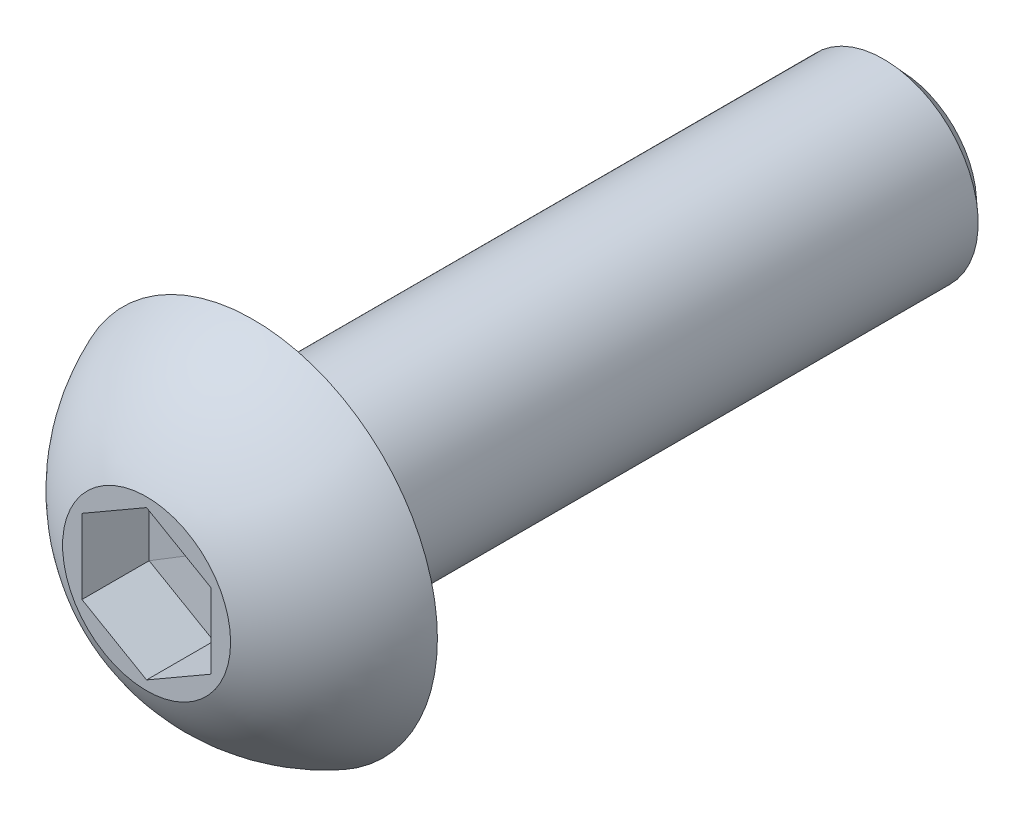
ISO-10303-21;
HEADER;
FILE_DESCRIPTION(('STEP AP214'),'2;1');
FILE_NAME('part.step','',(''),(''),'','','');
FILE_SCHEMA(('AUTOMOTIVE_DESIGN { 1 0 10303 214 1 1 1 1 }'));
ENDSEC;
DATA;
#1=APPLICATION_CONTEXT('core data for automotive mechanical design processes');
#2=APPLICATION_PROTOCOL_DEFINITION('international standard','automotive_design',2000,#1);
#3=PRODUCT_CONTEXT('',#1,'mechanical');
#4=PRODUCT('Part','Part','',(#3));
#5=PRODUCT_RELATED_PRODUCT_CATEGORY('part','',(#4));
#6=PRODUCT_DEFINITION_FORMATION('','',#4);
#7=PRODUCT_DEFINITION_CONTEXT('part definition',#1,'design');
#8=PRODUCT_DEFINITION('design','',#6,#7);
#9=PRODUCT_DEFINITION_SHAPE('','',#8);
#10=(LENGTH_UNIT() NAMED_UNIT(*) SI_UNIT(.MILLI.,.METRE.));
#11=(NAMED_UNIT(*) PLANE_ANGLE_UNIT() SI_UNIT($,.RADIAN.));
#12=(NAMED_UNIT(*) SI_UNIT($,.STERADIAN.) SOLID_ANGLE_UNIT());
#13=UNCERTAINTY_MEASURE_WITH_UNIT(LENGTH_MEASURE(1.E-05),#10,'distance_accuracy_value','');
#14=(GEOMETRIC_REPRESENTATION_CONTEXT(3) GLOBAL_UNCERTAINTY_ASSIGNED_CONTEXT((#13)) GLOBAL_UNIT_ASSIGNED_CONTEXT((#10,
#11,#12)) REPRESENTATION_CONTEXT('',''));
#15=CARTESIAN_POINT('',(0.,0.,0.));
#16=DIRECTION('',(0.,0.,1.));
#17=DIRECTION('',(1.,0.,0.));
#18=AXIS2_PLACEMENT_3D('',#15,#16,#17);
#19=CARTESIAN_POINT('',(0.,0.,-1.12424242424493));
#20=DIRECTION('',(0.,0.,1.));
#21=DIRECTION('',(1.,0.,0.));
#22=AXIS2_PLACEMENT_3D('',#19,#20,#21);
#23=SPHERICAL_SURFACE('',#22,3.06372665694424);
#24=CARTESIAN_POINT('',(0.,0.,-6.18901368505757E-13));
#25=DIRECTION('',(0.,0.,-1.));
#26=DIRECTION('',(1.,0.,0.));
#27=AXIS2_PLACEMENT_3D('',#24,#25,#26);
#28=CIRCLE('',#27,2.85);
#29=CARTESIAN_POINT('',(2.85,0.,-6.19513121358217E-13));
#30=VERTEX_POINT('',#29);
#31=EDGE_CURVE('E259',#30,#30,#28,.T.);
#32=CARTESIAN_POINT('',(0.,0.,1.64999999999826));
#33=DIRECTION('',(0.,0.,-1.));
#34=DIRECTION('',(1.,0.,0.));
#35=AXIS2_PLACEMENT_3D('',#32,#33,#34);
#36=CIRCLE('',#35,1.3);
#37=CARTESIAN_POINT('',(1.3,0.,1.64999999999826));
#38=VERTEX_POINT('',#37);
#39=EDGE_CURVE('E11',#38,#38,#36,.T.);
#40=CARTESIAN_POINT('',(2.85,0.,-6.19513121358217E-13));
#41=CARTESIAN_POINT('',(2.84113663386438,0.,0.0224691478441885));
#42=CARTESIAN_POINT('',(2.83200744713932,0.,0.0448334346415224));
#43=CARTESIAN_POINT('',(2.81322277135792,0.,0.0893398740637597));
#44=CARTESIAN_POINT('',(2.80356728230158,0.,0.111482026688663));
#45=CARTESIAN_POINT('',(2.78373534070524,0.,0.155531785688557));
#46=CARTESIAN_POINT('',(2.77355888816524,0.,0.177439392063547));
#47=CARTESIAN_POINT('',(2.75269072874905,0.,0.221007810980512));
#48=CARTESIAN_POINT('',(2.74199902187286,0.,0.242668623522487));
#49=CARTESIAN_POINT('',(2.72010633001629,0.,0.285731336319961));
#50=CARTESIAN_POINT('',(2.70890534503591,0.,0.307133236575461));
#51=CARTESIAN_POINT('',(2.68600036374526,0.,0.349666153566638));
#52=CARTESIAN_POINT('',(2.67429636743499,0.,0.370797170302315));
#53=CARTESIAN_POINT('',(2.65039191011443,0.,0.412776499906091));
#54=CARTESIAN_POINT('',(2.63819144910415,0.,0.43362481277419));
#55=CARTESIAN_POINT('',(2.61330088713121,0.,0.475027072604823));
#56=CARTESIAN_POINT('',(2.60061078616854,0.,0.495581019567358));
#57=CARTESIAN_POINT('',(2.57474804282301,0.,0.536383050164513));
#58=CARTESIAN_POINT('',(2.56157540044014,0.,0.556631133799134));
#59=CARTESIAN_POINT('',(2.5347549427383,0.,0.596810111423456));
#60=CARTESIAN_POINT('',(2.52110712741934,0.,0.616741005413157));
#61=CARTESIAN_POINT('',(2.4933439581226,0.,0.65627445485604));
#62=CARTESIAN_POINT('',(2.47922860414483,0.,0.675877010309222));
#63=CARTESIAN_POINT('',(2.45053825334038,0.,0.714742817453493));
#64=CARTESIAN_POINT('',(2.43596325651371,0.,0.734006069144583));
#65=CARTESIAN_POINT('',(2.40636177293462,0.,0.772182493337707));
#66=CARTESIAN_POINT('',(2.3913352861822,0.,0.791095665839741));
#67=CARTESIAN_POINT('',(2.36083922822819,0.,0.828561352054224));
#68=CARTESIAN_POINT('',(2.34536965702658,0.,0.847113865766673));
#69=CARTESIAN_POINT('',(2.31399608350211,0.,0.883847856545803));
#70=CARTESIAN_POINT('',(2.29809208117924,0.,0.902029333612484));
#71=CARTESIAN_POINT('',(2.2658585417511,0.,0.9380110807934));
#72=CARTESIAN_POINT('',(2.24952900464583,0.,0.955811350907635));
#73=CARTESIAN_POINT('',(2.21645353002628,0.,0.991020727115519));
#74=CARTESIAN_POINT('',(2.199707592512,0.,1.00842983320917));
#75=CARTESIAN_POINT('',(2.16580868437278,0.,1.04284714311604));
#76=CARTESIAN_POINT('',(2.14865571374784,0.,1.05985534692926));
#77=CARTESIAN_POINT('',(2.11395233437076,0.,1.09346133827109));
#78=CARTESIAN_POINT('',(2.09640192561862,0.,1.1100591257997));
#79=CARTESIAN_POINT('',(2.06091348728849,0.,1.14283500014571));
#80=CARTESIAN_POINT('',(2.0429754577105,0.,1.15901308696311));
#81=CARTESIAN_POINT('',(2.00672181185633,0.,1.19094051023115));
#82=CARTESIAN_POINT('',(1.98840619558015,0.,1.20668984668179));
#83=CARTESIAN_POINT('',(1.95140762167076,0.,1.23775095939414));
#84=CARTESIAN_POINT('',(1.93272466403755,0.,1.25306273565586));
#85=CARTESIAN_POINT('',(1.89500185823745,0.,1.28324016292891));
#86=CARTESIAN_POINT('',(1.87596201007056,0.,1.29810581394025));
#87=CARTESIAN_POINT('',(1.83753607366394,0.,1.32738267520553));
#88=CARTESIAN_POINT('',(1.81814998542421,0.,1.34179388545946));
#89=CARTESIAN_POINT('',(1.77904241300783,0.,1.37015380389914));
#90=CARTESIAN_POINT('',(1.75932092883117,0.,1.38410251208489));
#91=CARTESIAN_POINT('',(1.71955359630387,0.,1.41152962381899));
#92=CARTESIAN_POINT('',(1.69950774795322,0.,1.42500802736734));
#93=CARTESIAN_POINT('',(1.65910290023013,0.,1.45148699022933));
#94=CARTESIAN_POINT('',(1.63874390085769,0.,1.46448754954297));
#95=CARTESIAN_POINT('',(1.5977241396095,0.,1.49000355202858));
#96=CARTESIAN_POINT('',(1.57706337773376,0.,1.50251899520054));
#97=CARTESIAN_POINT('',(1.53545164806253,0.,1.52705776338423));
#98=CARTESIAN_POINT('',(1.51450068026704,0.,1.53908108839595));
#99=CARTESIAN_POINT('',(1.47232026041393,0.,1.56262889902368));
#100=CARTESIAN_POINT('',(1.45109080835631,0.,1.57415338463968));
#101=CARTESIAN_POINT('',(1.40836528719071,0.,1.59669705374116));
#102=CARTESIAN_POINT('',(1.38686921808273,0.,1.60771623722664));
#103=CARTESIAN_POINT('',(1.34362251732277,0.,1.62924319863871));
#104=CARTESIAN_POINT('',(1.3218718856708,0.,1.63975097656529));
#105=CARTESIAN_POINT('',(1.3,0.,1.64999999999826));
#106=B_SPLINE_CURVE_WITH_KNOTS('',3,(#40,#41,#42,#43,#44,#45,#46,#47,#48,#49,#50,#51,#52,#53,
#54,#55,#56,#57,#58,#59,#60,#61,#62,#63,#64,#65,#66,#67,#68,#69,#70,#71,#72,#73,#74,#75,#76,#77,
#78,#79,#80,#81,#82,#83,#84,#85,#86,#87,#88,#89,#90,#91,#92,#93,#94,#95,#96,#97,#98,#99,#100,
#101,#102,#103,#104,#105),.UNSPECIFIED.,.F.,.F.,(4,2,2,2,2,2,2,2,2,2,2,2,2,2,2,2,2,2,2,2,2,2,2,
2,2,2,2,2,2,2,2,2,4),(0.,0.0724606888856228,0.144921377771245,0.217382066656868,
0.289842755542491,0.362303444428113,0.434764133313736,0.507224822199358,0.579685511084981,
0.652146199970604,0.724606888856226,0.797067577741849,0.869528266627472,0.941988955513094,
1.01444964439872,1.08691033328434,1.15937102216996,1.23183171105558,1.30429239994121,
1.37675308882683,1.44921377771245,1.52167446659808,1.5941351554837,1.66659584436932,
1.73905653325494,1.81151722214057,1.88397791102619,1.95643859991181,2.02889928879743,
2.10135997768306,2.17382066656868,2.2462813554543,2.31874204433992),.UNSPECIFIED.);
#107=EDGE_CURVE('BSEAM17',#30,#38,#106,.T.);
#108=ORIENTED_EDGE('',*,*,#31,.F.);
#109=ORIENTED_EDGE('',*,*,#39,.T.);
#110=ORIENTED_EDGE('',*,*,#107,.T.);
#111=ORIENTED_EDGE('',*,*,#107,.F.);
#112=EDGE_LOOP('',(#108,#110,#109,#111));
#113=FACE_BOUND('',#112,.T.);
#114=ADVANCED_FACE('F17',(#113),#23,.T.);
#115=CARTESIAN_POINT('',(-1.3,0.,1.64999999999826));
#116=DIRECTION('',(0.,0.,1.));
#117=DIRECTION('',(1.,0.,0.));
#118=AXIS2_PLACEMENT_3D('',#115,#116,#117);
#119=PLANE('',#118);
#120=DIRECTION('',(-0.866025403784439,-0.5,0.));
#121=VECTOR('',#120,1.);
#122=CARTESIAN_POINT('',(0.2625,-1.00314609271698,1.64999999999826));
#123=LINE('',#122,#121);
#124=CARTESIAN_POINT('',(1.,-0.577350269189626,1.65));
#125=VERTEX_POINT('',#124);
#126=CARTESIAN_POINT('',(0.,-1.15470053837925,1.65));
#127=VERTEX_POINT('',#126);
#128=EDGE_CURVE('E93',#125,#127,#123,.T.);
#129=ORIENTED_EDGE('',*,*,#128,.T.);
#130=DIRECTION('',(-0.866025403784438,0.5,0.));
#131=VECTOR('',#130,1.);
#132=CARTESIAN_POINT('',(-0.7375,-0.728904714851902,1.64999999999826));
#133=LINE('',#132,#131);
#134=CARTESIAN_POINT('',(-1.,-0.577350269189624,1.65));
#135=VERTEX_POINT('',#134);
#136=EDGE_CURVE('E26',#127,#135,#133,.T.);
#137=ORIENTED_EDGE('',*,*,#136,.T.);
#138=DIRECTION('',(0.,1.,0.));
#139=VECTOR('',#138,1.);
#140=CARTESIAN_POINT('',(-1.,-0.288675134594812,1.64999999999826));
#141=LINE('',#140,#139);
#142=CARTESIAN_POINT('',(-1.,0.577350269189627,1.65));
#143=VERTEX_POINT('',#142);
#144=EDGE_CURVE('E44',#135,#143,#141,.T.);
#145=ORIENTED_EDGE('',*,*,#144,.T.);
#146=DIRECTION('',(0.866025403784439,0.5,0.));
#147=VECTOR('',#146,1.);
#148=CARTESIAN_POINT('',(-1.2375,0.44022958025709,1.64999999999826));
#149=LINE('',#148,#147);
#150=CARTESIAN_POINT('',(0.,1.15470053837925,1.65));
#151=VERTEX_POINT('',#150);
#152=EDGE_CURVE('E135',#143,#151,#149,.T.);
#153=ORIENTED_EDGE('',*,*,#152,.T.);
#154=DIRECTION('',(0.866025403784439,-0.5,0.));
#155=VECTOR('',#154,1.);
#156=CARTESIAN_POINT('',(-0.2375,1.29182122731179,1.64999999999826));
#157=LINE('',#156,#155);
#158=CARTESIAN_POINT('',(1.,0.577350269189627,1.65));
#159=VERTEX_POINT('',#158);
#160=EDGE_CURVE('E95',#151,#159,#157,.T.);
#161=ORIENTED_EDGE('',*,*,#160,.T.);
#162=DIRECTION('',(0.,-1.,0.));
#163=VECTOR('',#162,1.);
#164=CARTESIAN_POINT('',(1.,0.288675134594813,1.64999999999826));
#165=LINE('',#164,#163);
#166=EDGE_CURVE('E89',#159,#125,#165,.T.);
#167=ORIENTED_EDGE('',*,*,#166,.T.);
#168=EDGE_LOOP('',(#129,#137,#145,#153,#161,#167));
#169=FACE_BOUND('',#168,.T.);
#170=ORIENTED_EDGE('',*,*,#39,.F.);
#171=EDGE_LOOP('',(#170));
#172=FACE_BOUND('',#171,.T.);
#173=ADVANCED_FACE('F19',(#169,#172),#119,.T.);
#174=CARTESIAN_POINT('',(0.,0.,-10.));
#175=DIRECTION('',(0.,0.,-1.));
#176=DIRECTION('',(-1.,0.,0.));
#177=AXIS2_PLACEMENT_3D('',#174,#175,#176);
#178=PLANE('',#177);
#179=CARTESIAN_POINT('',(0.,0.,-10.));
#180=DIRECTION('',(0.,0.,-1.));
#181=DIRECTION('',(-1.,0.,0.));
#182=AXIS2_PLACEMENT_3D('',#179,#180,#181);
#183=CIRCLE('',#182,1.193275);
#184=CARTESIAN_POINT('',(-1.193275,0.,-10.));
#185=VERTEX_POINT('',#184);
#186=EDGE_CURVE('E282',#185,#185,#183,.T.);
#187=ORIENTED_EDGE('',*,*,#186,.T.);
#188=EDGE_LOOP('',(#187));
#189=FACE_BOUND('',#188,.T.);
#190=ADVANCED_FACE('F320',(#189),#178,.T.);
#191=CARTESIAN_POINT('',(0.,-1.15470053837925,1.65));
#192=DIRECTION('',(-0.5,-0.866025403784438,0.));
#193=DIRECTION('',(-0.866025403784438,0.5,0.));
#194=AXIS2_PLACEMENT_3D('',#191,#192,#193);
#195=PLANE('',#194);
#196=ORIENTED_EDGE('',*,*,#136,.F.);
#197=DIRECTION('',(0.,0.,-1.));
#198=VECTOR('',#197,1.);
#199=CARTESIAN_POINT('',(0.,-1.15470053837925,1.65));
#200=LINE('',#199,#198);
#201=CARTESIAN_POINT('',(0.,-1.15470053837925,0.61));
#202=VERTEX_POINT('',#201);
#203=EDGE_CURVE('E100',#127,#202,#200,.T.);
#204=ORIENTED_EDGE('',*,*,#203,.T.);
#205=DIRECTION('',(-0.866025403784438,0.5,0.));
#206=VECTOR('',#205,1.);
#207=CARTESIAN_POINT('',(-1.,-0.577350269189624,0.61));
#208=LINE('',#207,#206);
#209=CARTESIAN_POINT('',(-1.,-0.577350269189624,0.61));
#210=VERTEX_POINT('',#209);
#211=EDGE_CURVE('E115',#202,#210,#208,.T.);
#212=ORIENTED_EDGE('',*,*,#211,.T.);
#213=DIRECTION('',(0.,0.,-1.));
#214=VECTOR('',#213,1.);
#215=CARTESIAN_POINT('',(-1.,-0.577350269189624,1.65));
#216=LINE('',#215,#214);
#217=EDGE_CURVE('E139',#135,#210,#216,.T.);
#218=ORIENTED_EDGE('',*,*,#217,.F.);
#219=EDGE_LOOP('',(#196,#204,#212,#218));
#220=FACE_BOUND('',#219,.T.);
#221=ADVANCED_FACE('F354',(#220),#195,.F.);
#222=CARTESIAN_POINT('',(-1.,-0.577350269189624,1.65));
#223=DIRECTION('',(-1.,0.,0.));
#224=DIRECTION('',(0.,0.,1.));
#225=AXIS2_PLACEMENT_3D('',#222,#223,#224);
#226=PLANE('',#225);
#227=ORIENTED_EDGE('',*,*,#144,.F.);
#228=ORIENTED_EDGE('',*,*,#217,.T.);
#229=DIRECTION('',(0.,1.,0.));
#230=VECTOR('',#229,1.);
#231=CARTESIAN_POINT('',(-1.,0.577350269189627,0.61));
#232=LINE('',#231,#230);
#233=CARTESIAN_POINT('',(-1.,0.577350269189627,0.61));
#234=VERTEX_POINT('',#233);
#235=EDGE_CURVE('E197',#210,#234,#232,.T.);
#236=ORIENTED_EDGE('',*,*,#235,.T.);
#237=DIRECTION('',(0.,0.,-1.));
#238=VECTOR('',#237,1.);
#239=CARTESIAN_POINT('',(-1.,0.577350269189627,1.65));
#240=LINE('',#239,#238);
#241=EDGE_CURVE('E138',#143,#234,#240,.T.);
#242=ORIENTED_EDGE('',*,*,#241,.F.);
#243=EDGE_LOOP('',(#227,#228,#236,#242));
#244=FACE_BOUND('',#243,.T.);
#245=ADVANCED_FACE('F342',(#244),#226,.F.);
#246=CARTESIAN_POINT('',(-1.,0.577350269189627,1.65));
#247=DIRECTION('',(-0.5,0.866025403784439,0.));
#248=DIRECTION('',(0.,0.,1.));
#249=AXIS2_PLACEMENT_3D('',#246,#247,#248);
#250=PLANE('',#249);
#251=ORIENTED_EDGE('',*,*,#152,.F.);
#252=ORIENTED_EDGE('',*,*,#241,.T.);
#253=DIRECTION('',(0.866025403784439,0.5,0.));
#254=VECTOR('',#253,1.);
#255=CARTESIAN_POINT('',(0.,1.15470053837925,0.61));
#256=LINE('',#255,#254);
#257=CARTESIAN_POINT('',(0.,1.15470053837925,0.61));
#258=VERTEX_POINT('',#257);
#259=EDGE_CURVE('E208',#234,#258,#256,.T.);
#260=ORIENTED_EDGE('',*,*,#259,.T.);
#261=DIRECTION('',(0.,0.,-1.));
#262=VECTOR('',#261,1.);
#263=CARTESIAN_POINT('',(0.,1.15470053837925,1.65));
#264=LINE('',#263,#262);
#265=EDGE_CURVE('E132',#151,#258,#264,.T.);
#266=ORIENTED_EDGE('',*,*,#265,.F.);
#267=EDGE_LOOP('',(#251,#252,#260,#266));
#268=FACE_BOUND('',#267,.T.);
#269=ADVANCED_FACE('F338',(#268),#250,.F.);
#270=CARTESIAN_POINT('',(0.,1.15470053837925,1.65));
#271=DIRECTION('',(0.5,0.866025403784439,0.));
#272=DIRECTION('',(0.,0.,-1.));
#273=AXIS2_PLACEMENT_3D('',#270,#271,#272);
#274=PLANE('',#273);
#275=ORIENTED_EDGE('',*,*,#160,.F.);
#276=ORIENTED_EDGE('',*,*,#265,.T.);
#277=DIRECTION('',(0.866025403784439,-0.5,0.));
#278=VECTOR('',#277,1.);
#279=CARTESIAN_POINT('',(1.,0.577350269189627,0.61));
#280=LINE('',#279,#278);
#281=CARTESIAN_POINT('',(1.,0.577350269189627,0.61));
#282=VERTEX_POINT('',#281);
#283=EDGE_CURVE('E224',#258,#282,#280,.T.);
#284=ORIENTED_EDGE('',*,*,#283,.T.);
#285=DIRECTION('',(0.,0.,-1.));
#286=VECTOR('',#285,1.);
#287=CARTESIAN_POINT('',(1.,0.577350269189627,1.65));
#288=LINE('',#287,#286);
#289=EDGE_CURVE('E99',#159,#282,#288,.T.);
#290=ORIENTED_EDGE('',*,*,#289,.F.);
#291=EDGE_LOOP('',(#275,#276,#284,#290));
#292=FACE_BOUND('',#291,.T.);
#293=ADVANCED_FACE('F341',(#292),#274,.F.);
#294=CARTESIAN_POINT('',(1.,0.577350269189627,1.65));
#295=DIRECTION('',(1.,0.,0.));
#296=DIRECTION('',(0.,1.,0.));
#297=AXIS2_PLACEMENT_3D('',#294,#295,#296);
#298=PLANE('',#297);
#299=ORIENTED_EDGE('',*,*,#166,.F.);
#300=ORIENTED_EDGE('',*,*,#289,.T.);
#301=DIRECTION('',(0.,-1.,0.));
#302=VECTOR('',#301,1.);
#303=CARTESIAN_POINT('',(1.,-0.577350269189626,0.61));
#304=LINE('',#303,#302);
#305=CARTESIAN_POINT('',(1.,-0.577350269189626,0.61));
#306=VERTEX_POINT('',#305);
#307=EDGE_CURVE('E106',#282,#306,#304,.T.);
#308=ORIENTED_EDGE('',*,*,#307,.T.);
#309=DIRECTION('',(0.,0.,-1.));
#310=VECTOR('',#309,1.);
#311=CARTESIAN_POINT('',(1.,-0.577350269189626,1.65));
#312=LINE('',#311,#310);
#313=EDGE_CURVE('E103',#125,#306,#312,.T.);
#314=ORIENTED_EDGE('',*,*,#313,.F.);
#315=EDGE_LOOP('',(#299,#300,#308,#314));
#316=FACE_BOUND('',#315,.T.);
#317=ADVANCED_FACE('F104',(#316),#298,.F.);
#318=CARTESIAN_POINT('',(1.,-0.577350269189626,1.65));
#319=DIRECTION('',(0.5,-0.866025403784439,0.));
#320=DIRECTION('',(0.,0.,-1.));
#321=AXIS2_PLACEMENT_3D('',#318,#319,#320);
#322=PLANE('',#321);
#323=ORIENTED_EDGE('',*,*,#128,.F.);
#324=ORIENTED_EDGE('',*,*,#313,.T.);
#325=DIRECTION('',(-0.866025403784439,-0.5,0.));
#326=VECTOR('',#325,1.);
#327=CARTESIAN_POINT('',(0.,-1.15470053837925,0.61));
#328=LINE('',#327,#326);
#329=EDGE_CURVE('E247',#306,#202,#328,.T.);
#330=ORIENTED_EDGE('',*,*,#329,.T.);
#331=ORIENTED_EDGE('',*,*,#203,.F.);
#332=EDGE_LOOP('',(#323,#324,#330,#331));
#333=FACE_BOUND('',#332,.T.);
#334=ADVANCED_FACE('F113',(#333),#322,.F.);
#335=CARTESIAN_POINT('',(-1.,-0.577350269189624,0.61));
#336=DIRECTION('',(-0.0435778713738291,-0.0754790873051732,-0.996194698091746));
#337=DIRECTION('',(0.,-0.997141949694317,0.0755508581011304));
#338=AXIS2_PLACEMENT_3D('',#335,#336,#337);
#339=PLANE('',#338);
#340=DIRECTION('',(0.863550259614423,0.498570974847158,-0.0755508581011305));
#341=VECTOR('',#340,1.);
#342=CARTESIAN_POINT('',(-0.751426983039955,-0.433836570934464,0.588252678957559));
#343=LINE('',#342,#341);
#344=CARTESIAN_POINT('',(0.,0.,0.522511336474076));
#345=VERTEX_POINT('',#344);
#346=EDGE_CURVE('E122',#210,#345,#343,.T.);
#347=ORIENTED_EDGE('',*,*,#346,.F.);
#348=ORIENTED_EDGE('',*,*,#211,.F.);
#349=DIRECTION('',(0.,0.997141949694317,-0.0755508581011306));
#350=VECTOR('',#349,1.);
#351=CARTESIAN_POINT('',(0.,-0.867673141868932,0.588252678957559));
#352=LINE('',#351,#350);
#353=EDGE_CURVE('E252',#202,#345,#352,.T.);
#354=ORIENTED_EDGE('',*,*,#353,.T.);
#355=EDGE_LOOP('',(#347,#348,#354));
#356=FACE_BOUND('',#355,.T.);
#357=ADVANCED_FACE('F358',(#356),#339,.F.);
#358=CARTESIAN_POINT('',(-1.,0.577350269189627,0.61));
#359=DIRECTION('',(-0.0871557427476581,0.,-0.996194698091746));
#360=DIRECTION('',(-0.996194698091746,0.,0.0871557427476581));
#361=AXIS2_PLACEMENT_3D('',#358,#359,#360);
#362=PLANE('',#361);
#363=DIRECTION('',(0.863550259614423,-0.498570974847159,-0.0755508581011305));
#364=VECTOR('',#363,1.);
#365=CARTESIAN_POINT('',(-0.751426983039955,0.433836570934466,0.588252678957559));
#366=LINE('',#365,#364);
#367=EDGE_CURVE('E202',#234,#345,#366,.T.);
#368=ORIENTED_EDGE('',*,*,#367,.F.);
#369=ORIENTED_EDGE('',*,*,#235,.F.);
#370=ORIENTED_EDGE('',*,*,#346,.T.);
#371=EDGE_LOOP('',(#368,#369,#370));
#372=FACE_BOUND('',#371,.T.);
#373=ADVANCED_FACE('F350',(#372),#362,.F.);
#374=CARTESIAN_POINT('',(0.,1.15470053837925,0.61));
#375=DIRECTION('',(-0.043577871373829,0.0754790873051733,-0.996194698091746));
#376=DIRECTION('',(-0.999044587684655,0.,0.043702537889669));
#377=AXIS2_PLACEMENT_3D('',#374,#375,#376);
#378=PLANE('',#377);
#379=DIRECTION('',(0.,-0.997141949694317,-0.0755508581011306));
#380=VECTOR('',#379,1.);
#381=CARTESIAN_POINT('',(0.,0.867673141868933,0.588252678957559));
#382=LINE('',#381,#380);
#383=EDGE_CURVE('E216',#258,#345,#382,.T.);
#384=ORIENTED_EDGE('',*,*,#383,.F.);
#385=ORIENTED_EDGE('',*,*,#259,.F.);
#386=ORIENTED_EDGE('',*,*,#367,.T.);
#387=EDGE_LOOP('',(#384,#385,#386));
#388=FACE_BOUND('',#387,.T.);
#389=ADVANCED_FACE('F346',(#388),#378,.F.);
#390=CARTESIAN_POINT('',(1.,0.577350269189627,0.61));
#391=DIRECTION('',(0.0435778713738291,0.0754790873051733,-0.996194698091746));
#392=DIRECTION('',(-0.999044587684655,0.,-0.0437025378896691));
#393=AXIS2_PLACEMENT_3D('',#390,#391,#392);
#394=PLANE('',#393);
#395=DIRECTION('',(-0.863550259614423,-0.498570974847158,-0.0755508581011305));
#396=VECTOR('',#395,1.);
#397=CARTESIAN_POINT('',(0.751426983039954,0.433836570934467,0.588252678957559));
#398=LINE('',#397,#396);
#399=EDGE_CURVE('E231',#282,#345,#398,.T.);
#400=ORIENTED_EDGE('',*,*,#399,.F.);
#401=ORIENTED_EDGE('',*,*,#283,.F.);
#402=ORIENTED_EDGE('',*,*,#383,.T.);
#403=EDGE_LOOP('',(#400,#401,#402));
#404=FACE_BOUND('',#403,.T.);
#405=ADVANCED_FACE('F336',(#404),#394,.F.);
#406=CARTESIAN_POINT('',(1.,-0.577350269189626,0.61));
#407=DIRECTION('',(0.0871557427476581,0.,-0.996194698091746));
#408=DIRECTION('',(0.,-1.,0.));
#409=AXIS2_PLACEMENT_3D('',#406,#407,#408);
#410=PLANE('',#409);
#411=DIRECTION('',(-0.863550259614423,0.498570974847158,-0.0755508581011305));
#412=VECTOR('',#411,1.);
#413=CARTESIAN_POINT('',(0.751426983039954,-0.433836570934466,0.588252678957559));
#414=LINE('',#413,#412);
#415=EDGE_CURVE('E241',#306,#345,#414,.T.);
#416=ORIENTED_EDGE('',*,*,#415,.F.);
#417=ORIENTED_EDGE('',*,*,#307,.F.);
#418=ORIENTED_EDGE('',*,*,#399,.T.);
#419=EDGE_LOOP('',(#416,#417,#418));
#420=FACE_BOUND('',#419,.T.);
#421=ADVANCED_FACE('F332',(#420),#410,.F.);
#422=CARTESIAN_POINT('',(0.,-1.15470053837925,0.61));
#423=DIRECTION('',(0.0435778713738291,-0.0754790873051733,-0.996194698091746));
#424=DIRECTION('',(0.,-0.997141949694317,0.0755508581011305));
#425=AXIS2_PLACEMENT_3D('',#422,#423,#424);
#426=PLANE('',#425);
#427=ORIENTED_EDGE('',*,*,#353,.F.);
#428=ORIENTED_EDGE('',*,*,#329,.F.);
#429=ORIENTED_EDGE('',*,*,#415,.T.);
#430=EDGE_LOOP('',(#427,#428,#429));
#431=FACE_BOUND('',#430,.T.);
#432=ADVANCED_FACE('F328',(#431),#426,.F.);
#433=CARTESIAN_POINT('',(0.,0.,-5.00000000000016));
#434=DIRECTION('',(0.,0.,-1.));
#435=DIRECTION('',(-1.,0.,0.));
#436=AXIS2_PLACEMENT_3D('',#433,#434,#435);
#437=CYLINDRICAL_SURFACE('',#436,1.4635);
#438=CARTESIAN_POINT('',(0.,0.,-0.300000000000326));
#439=DIRECTION('',(0.,0.,1.));
#440=DIRECTION('',(-1.,0.,0.));
#441=AXIS2_PLACEMENT_3D('',#438,#439,#440);
#442=CIRCLE('',#441,1.4635);
#443=CARTESIAN_POINT('',(-1.4635,0.,-0.300000000000326));
#444=VERTEX_POINT('',#443);
#445=EDGE_CURVE('E267',#444,#444,#442,.T.);
#446=ORIENTED_EDGE('',*,*,#445,.F.);
#447=EDGE_LOOP('',(#446));
#448=FACE_BOUND('',#447,.T.);
#449=CARTESIAN_POINT('',(0.,0.,-9.75385028398544));
#450=DIRECTION('',(0.,0.,1.));
#451=DIRECTION('',(-1.,0.,0.));
#452=AXIS2_PLACEMENT_3D('',#449,#450,#451);
#453=CIRCLE('',#452,1.4635);
#454=CARTESIAN_POINT('',(-1.4635,0.,-9.75385028398544));
#455=VERTEX_POINT('',#454);
#456=EDGE_CURVE('E288',#455,#455,#453,.T.);
#457=ORIENTED_EDGE('',*,*,#456,.T.);
#458=EDGE_LOOP('',(#457));
#459=FACE_BOUND('',#458,.T.);
#460=ADVANCED_FACE('F297',(#448,#459),#437,.T.);
#461=CARTESIAN_POINT('',(-1.5,0.,-3.25324639384063E-13));
#462=DIRECTION('',(0.,0.,-1.));
#463=DIRECTION('',(-1.,0.,0.));
#464=AXIS2_PLACEMENT_3D('',#461,#462,#463);
#465=PLANE('',#464);
#466=CARTESIAN_POINT('',(0.,0.,-3.25746374318925E-13));
#467=DIRECTION('',(0.,0.,-1.));
#468=DIRECTION('',(-1.,0.,0.));
#469=AXIS2_PLACEMENT_3D('',#466,#467,#468);
#470=CIRCLE('',#469,1.7635);
#471=CARTESIAN_POINT('',(-1.7635,0.,-3.25260824266699E-13));
#472=VERTEX_POINT('',#471);
#473=EDGE_CURVE('E275',#472,#472,#470,.T.);
#474=ORIENTED_EDGE('',*,*,#473,.F.);
#475=EDGE_LOOP('',(#474));
#476=FACE_BOUND('',#475,.T.);
#477=ORIENTED_EDGE('',*,*,#31,.T.);
#478=EDGE_LOOP('',(#477));
#479=FACE_BOUND('',#478,.T.);
#480=ADVANCED_FACE('F308',(#476,#479),#465,.T.);
#481=CARTESIAN_POINT('',(0.,0.,-0.300000000000326));
#482=DIRECTION('',(0.,0.,-1.));
#483=DIRECTION('',(-1.,0.,0.));
#484=AXIS2_PLACEMENT_3D('',#481,#482,#483);
#485=TOROIDAL_SURFACE('',#484,1.7635,0.3);
#486=ORIENTED_EDGE('',*,*,#445,.T.);
#487=EDGE_LOOP('',(#486));
#488=FACE_BOUND('',#487,.T.);
#489=ORIENTED_EDGE('',*,*,#473,.T.);
#490=EDGE_LOOP('',(#489));
#491=FACE_BOUND('',#490,.T.);
#492=ADVANCED_FACE('F301',(#488,#491),#485,.F.);
#493=CARTESIAN_POINT('',(0.,0.,-9.84663749999999));
#494=DIRECTION('',(0.,0.,1.));
#495=DIRECTION('',(-1.,0.,0.));
#496=AXIS2_PLACEMENT_3D('',#493,#494,#495);
#497=CONICAL_SURFACE('',#496,1.3616375,0.831988093683015);
#498=ORIENTED_EDGE('',*,*,#186,.F.);
#499=EDGE_LOOP('',(#498));
#500=FACE_BOUND('',#499,.T.);
#501=ORIENTED_EDGE('',*,*,#456,.F.);
#502=EDGE_LOOP('',(#501));
#503=FACE_BOUND('',#502,.T.);
#504=ADVANCED_FACE('F299',(#500,#503),#497,.T.);
#505=CLOSED_SHELL('',(#114,#173,#190,#221,#245,#269,#293,#317,#334,#357,#373,#389,#405,#421,
#432,#460,#480,#492,#504));
#506=MANIFOLD_SOLID_BREP('B1',#505);
#507=ADVANCED_BREP_SHAPE_REPRESENTATION('',(#18,#506),#14);
#508=SHAPE_DEFINITION_REPRESENTATION(#9,#507);
ENDSEC;
END-ISO-10303-21;
